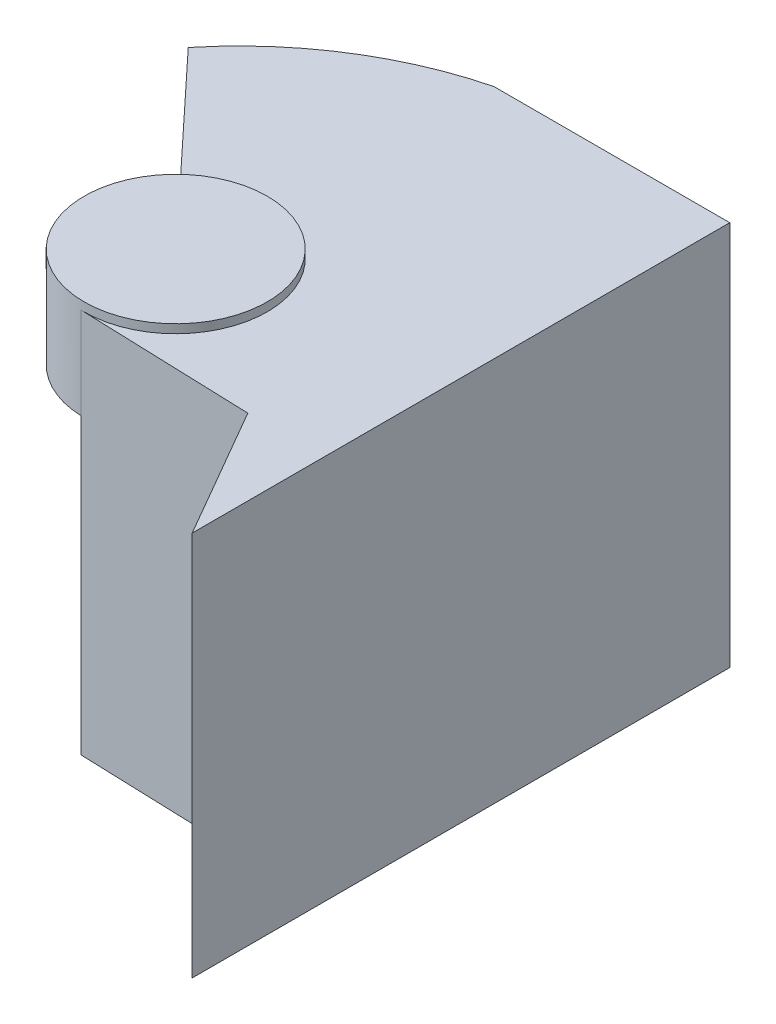
ISO-10303-21;
HEADER;
FILE_DESCRIPTION(('STEP AP214'),'2;1');
FILE_NAME('part.step','',(''),(''),'','','');
FILE_SCHEMA(('AUTOMOTIVE_DESIGN { 1 0 10303 214 1 1 1 1 }'));
ENDSEC;
DATA;
#1=APPLICATION_CONTEXT('core data for automotive mechanical design processes');
#2=APPLICATION_PROTOCOL_DEFINITION('international standard','automotive_design',2000,#1);
#3=PRODUCT_CONTEXT('',#1,'mechanical');
#4=PRODUCT('Part','Part','',(#3));
#5=PRODUCT_RELATED_PRODUCT_CATEGORY('part','',(#4));
#6=PRODUCT_DEFINITION_FORMATION('','',#4);
#7=PRODUCT_DEFINITION_CONTEXT('part definition',#1,'design');
#8=PRODUCT_DEFINITION('design','',#6,#7);
#9=PRODUCT_DEFINITION_SHAPE('','',#8);
#10=(LENGTH_UNIT() NAMED_UNIT(*) SI_UNIT(.MILLI.,.METRE.));
#11=(NAMED_UNIT(*) PLANE_ANGLE_UNIT() SI_UNIT($,.RADIAN.));
#12=(NAMED_UNIT(*) SI_UNIT($,.STERADIAN.) SOLID_ANGLE_UNIT());
#13=UNCERTAINTY_MEASURE_WITH_UNIT(LENGTH_MEASURE(1.E-05),#10,'distance_accuracy_value','');
#14=(GEOMETRIC_REPRESENTATION_CONTEXT(3) GLOBAL_UNCERTAINTY_ASSIGNED_CONTEXT((#13)) GLOBAL_UNIT_ASSIGNED_CONTEXT((#10,
#11,#12)) REPRESENTATION_CONTEXT('',''));
#15=CARTESIAN_POINT('',(0.,0.,0.));
#16=DIRECTION('',(0.,0.,1.));
#17=DIRECTION('',(1.,0.,0.));
#18=AXIS2_PLACEMENT_3D('',#15,#16,#17);
#19=CARTESIAN_POINT('',(-143.94149440041,-223.,231.490942435364));
#20=DIRECTION('',(-0.999414944004102,0.,-0.0342018961649362));
#21=DIRECTION('',(-0.0342018961649362,0.,0.999414944004102));
#22=AXIS2_PLACEMENT_3D('',#19,#20,#21);
#23=PLANE('',#22);
#24=DIRECTION('',(0.,1.,0.));
#25=VECTOR('',#24,1.);
#26=CARTESIAN_POINT('',(-143.94149440041,-223.,231.490942435364));
#27=LINE('',#26,#25);
#28=CARTESIAN_POINT('',(-143.94149440041,-223.,231.490942435364));
#29=VERTEX_POINT('',#28);
#30=CARTESIAN_POINT('',(-143.94149440041,-53.,231.490942435364));
#31=VERTEX_POINT('',#30);
#32=EDGE_CURVE('E114',#29,#31,#27,.T.);
#33=ORIENTED_EDGE('',*,*,#32,.T.);
#34=DIRECTION('',(0.0342018961649362,0.,-0.999414944004102));
#35=VECTOR('',#34,1.);
#36=CARTESIAN_POINT('',(-143.94149440041,-53.,231.490942435364));
#37=LINE('',#36,#35);
#38=CARTESIAN_POINT('',(-142.128793903668,-53.,178.521950403146));
#39=VERTEX_POINT('',#38);
#40=EDGE_CURVE('E138',#31,#39,#37,.T.);
#41=ORIENTED_EDGE('',*,*,#40,.T.);
#42=DIRECTION('',(0.,1.,0.));
#43=VECTOR('',#42,1.);
#44=CARTESIAN_POINT('',(-142.128793903668,-223.,178.521950403146));
#45=LINE('',#44,#43);
#46=CARTESIAN_POINT('',(-142.128793903668,-223.,178.521950403146));
#47=VERTEX_POINT('',#46);
#48=EDGE_CURVE('E154',#47,#39,#45,.T.);
#49=ORIENTED_EDGE('',*,*,#48,.F.);
#50=DIRECTION('',(-0.0342018961649362,0.,0.999414944004102));
#51=VECTOR('',#50,1.);
#52=CARTESIAN_POINT('',(-143.94149440041,-223.,231.490942435364));
#53=LINE('',#52,#51);
#54=EDGE_CURVE('E127',#47,#29,#53,.T.);
#55=ORIENTED_EDGE('',*,*,#54,.T.);
#56=EDGE_LOOP('',(#33,#41,#49,#55));
#57=FACE_BOUND('',#56,.T.);
#58=ADVANCED_FACE('F38',(#57),#23,.T.);
#59=CARTESIAN_POINT('',(0.,-223.,0.));
#60=DIRECTION('',(0.,0.,-1.));
#61=DIRECTION('',(-1.,0.,0.));
#62=AXIS2_PLACEMENT_3D('',#59,#60,#61);
#63=PLANE('',#62);
#64=DIRECTION('',(-1.,0.,0.));
#65=VECTOR('',#64,1.);
#66=CARTESIAN_POINT('',(0.,0.,0.));
#67=LINE('',#66,#65);
#68=CARTESIAN_POINT('',(0.,0.,0.));
#69=VERTEX_POINT('',#68);
#70=CARTESIAN_POINT('',(-136.456740168811,0.,0.));
#71=VERTEX_POINT('',#70);
#72=EDGE_CURVE('E134',#69,#71,#67,.T.);
#73=ORIENTED_EDGE('',*,*,#72,.F.);
#74=DIRECTION('',(0.,1.,0.));
#75=VECTOR('',#74,1.);
#76=CARTESIAN_POINT('',(0.,-223.,0.));
#77=LINE('',#76,#75);
#78=CARTESIAN_POINT('',(0.,-223.,0.));
#79=VERTEX_POINT('',#78);
#80=EDGE_CURVE('E55',#79,#69,#77,.T.);
#81=ORIENTED_EDGE('',*,*,#80,.F.);
#82=DIRECTION('',(-1.,0.,0.));
#83=VECTOR('',#82,1.);
#84=CARTESIAN_POINT('',(0.,-223.,0.));
#85=LINE('',#84,#83);
#86=CARTESIAN_POINT('',(-136.456740168811,-223.,0.));
#87=VERTEX_POINT('',#86);
#88=EDGE_CURVE('E150',#79,#87,#85,.T.);
#89=ORIENTED_EDGE('',*,*,#88,.T.);
#90=DIRECTION('',(0.,1.,0.));
#91=VECTOR('',#90,1.);
#92=CARTESIAN_POINT('',(-136.456740168811,-223.,0.));
#93=LINE('',#92,#91);
#94=EDGE_CURVE('E91',#87,#71,#93,.T.);
#95=ORIENTED_EDGE('',*,*,#94,.T.);
#96=EDGE_LOOP('',(#73,#81,#89,#95));
#97=FACE_BOUND('',#96,.T.);
#98=ADVANCED_FACE('F40',(#97),#63,.T.);
#99=CARTESIAN_POINT('',(0.,-223.,0.));
#100=DIRECTION('',(1.,0.,0.));
#101=DIRECTION('',(0.,0.,-1.));
#102=AXIS2_PLACEMENT_3D('',#99,#100,#101);
#103=PLANE('',#102);
#104=DIRECTION('',(0.,0.,-1.));
#105=VECTOR('',#104,1.);
#106=CARTESIAN_POINT('',(0.,0.,0.));
#107=LINE('',#106,#105);
#108=CARTESIAN_POINT('',(0.,0.,311.121367584888));
#109=VERTEX_POINT('',#108);
#110=EDGE_CURVE('E147',#109,#69,#107,.T.);
#111=ORIENTED_EDGE('',*,*,#110,.F.);
#112=DIRECTION('',(0.,1.,0.));
#113=VECTOR('',#112,1.);
#114=CARTESIAN_POINT('',(0.,-223.,311.121367584888));
#115=LINE('',#114,#113);
#116=CARTESIAN_POINT('',(0.,-223.,311.121367584888));
#117=VERTEX_POINT('',#116);
#118=EDGE_CURVE('E79',#117,#109,#115,.T.);
#119=ORIENTED_EDGE('',*,*,#118,.F.);
#120=DIRECTION('',(0.,0.,-1.));
#121=VECTOR('',#120,1.);
#122=CARTESIAN_POINT('',(0.,-223.,0.));
#123=LINE('',#122,#121);
#124=EDGE_CURVE('E122',#117,#79,#123,.T.);
#125=ORIENTED_EDGE('',*,*,#124,.T.);
#126=ORIENTED_EDGE('',*,*,#80,.T.);
#127=EDGE_LOOP('',(#111,#119,#125,#126));
#128=FACE_BOUND('',#127,.T.);
#129=ADVANCED_FACE('F213',(#128),#103,.T.);
#130=CARTESIAN_POINT('',(0.,-223.,311.121367584888));
#131=DIRECTION('',(-0.866025403784442,0.,0.499999999999995));
#132=DIRECTION('',(0.499999999999995,0.,0.866025403784441));
#133=AXIS2_PLACEMENT_3D('',#130,#131,#132);
#134=PLANE('',#133);
#135=DIRECTION('',(0.499999999999995,0.,0.866025403784441));
#136=VECTOR('',#135,1.);
#137=CARTESIAN_POINT('',(0.,0.,311.121367584888));
#138=LINE('',#137,#136);
#139=CARTESIAN_POINT('',(-43.9999999999996,0.,234.911132051857));
#140=VERTEX_POINT('',#139);
#141=EDGE_CURVE('E109',#140,#109,#138,.T.);
#142=ORIENTED_EDGE('',*,*,#141,.F.);
#143=DIRECTION('',(0.,1.,0.));
#144=VECTOR('',#143,1.);
#145=CARTESIAN_POINT('',(-43.9999999999996,-223.,234.911132051857));
#146=LINE('',#145,#144);
#147=CARTESIAN_POINT('',(-43.9999999999996,-223.,234.911132051857));
#148=VERTEX_POINT('',#147);
#149=EDGE_CURVE('E104',#148,#140,#146,.T.);
#150=ORIENTED_EDGE('',*,*,#149,.F.);
#151=DIRECTION('',(0.499999999999995,0.,0.866025403784441));
#152=VECTOR('',#151,1.);
#153=CARTESIAN_POINT('',(0.,-223.,311.121367584888));
#154=LINE('',#153,#152);
#155=EDGE_CURVE('E107',#148,#117,#154,.T.);
#156=ORIENTED_EDGE('',*,*,#155,.T.);
#157=ORIENTED_EDGE('',*,*,#118,.T.);
#158=EDGE_LOOP('',(#142,#150,#156,#157));
#159=FACE_BOUND('',#158,.T.);
#160=ADVANCED_FACE('F106',(#159),#134,.T.);
#161=CARTESIAN_POINT('',(-43.9999999999996,-223.,234.911132051857));
#162=DIRECTION('',(-0.0342018961649354,0.,0.999414944004102));
#163=DIRECTION('',(0.999414944004102,0.,0.0342018961649354));
#164=AXIS2_PLACEMENT_3D('',#161,#162,#163);
#165=PLANE('',#164);
#166=DIRECTION('',(0.999414944004102,0.,0.0342018961649354));
#167=VECTOR('',#166,1.);
#168=CARTESIAN_POINT('',(-43.9999999999996,0.,234.911132051857));
#169=LINE('',#168,#167);
#170=CARTESIAN_POINT('',(-143.94149440041,0.,231.490942435364));
#171=VERTEX_POINT('',#170);
#172=EDGE_CURVE('E144',#171,#140,#169,.T.);
#173=ORIENTED_EDGE('',*,*,#172,.F.);
#174=DIRECTION('',(0.,1.,0.));
#175=VECTOR('',#174,1.);
#176=CARTESIAN_POINT('',(-143.94149440041,-53.,231.490942435364));
#177=LINE('',#176,#175);
#178=EDGE_CURVE('E169',#31,#171,#177,.T.);
#179=ORIENTED_EDGE('',*,*,#178,.F.);
#180=ORIENTED_EDGE('',*,*,#32,.F.);
#181=DIRECTION('',(0.999414944004102,0.,0.0342018961649354));
#182=VECTOR('',#181,1.);
#183=CARTESIAN_POINT('',(-43.9999999999996,-223.,234.911132051857));
#184=LINE('',#183,#182);
#185=EDGE_CURVE('E120',#29,#148,#184,.T.);
#186=ORIENTED_EDGE('',*,*,#185,.T.);
#187=ORIENTED_EDGE('',*,*,#149,.T.);
#188=EDGE_LOOP('',(#173,#179,#180,#186,#187));
#189=FACE_BOUND('',#188,.T.);
#190=ADVANCED_FACE('F124',(#189),#165,.T.);
#191=CARTESIAN_POINT('',(-142.128793903668,-223.,178.521950403146));
#192=DIRECTION('',(-0.730877476832137,0.,0.682508691416812));
#193=DIRECTION('',(0.682508691416812,0.,0.730877476832137));
#194=AXIS2_PLACEMENT_3D('',#191,#192,#193);
#195=PLANE('',#194);
#196=DIRECTION('',(0.,1.,0.));
#197=VECTOR('',#196,1.);
#198=CARTESIAN_POINT('',(-178.301754548759,-53.,139.785444131043));
#199=LINE('',#198,#197);
#200=CARTESIAN_POINT('',(-178.301754548759,0.,139.785444131043));
#201=VERTEX_POINT('',#200);
#202=CARTESIAN_POINT('',(-178.301754548759,-53.,139.785444131043));
#203=VERTEX_POINT('',#202);
#204=EDGE_CURVE('E174',#201,#203,#199,.F.);
#205=ORIENTED_EDGE('',*,*,#204,.F.);
#206=DIRECTION('',(0.682508691416812,0.,0.730877476832137));
#207=VECTOR('',#206,1.);
#208=CARTESIAN_POINT('',(-142.128793903668,0.,178.521950403146));
#209=LINE('',#208,#207);
#210=CARTESIAN_POINT('',(-244.50509761619,0.,68.8903288783257));
#211=VERTEX_POINT('',#210);
#212=EDGE_CURVE('E141',#211,#201,#209,.T.);
#213=ORIENTED_EDGE('',*,*,#212,.F.);
#214=DIRECTION('',(0.,1.,0.));
#215=VECTOR('',#214,1.);
#216=CARTESIAN_POINT('',(-244.50509761619,-223.,68.8903288783257));
#217=LINE('',#216,#215);
#218=CARTESIAN_POINT('',(-244.50509761619,-223.,68.8903288783257));
#219=VERTEX_POINT('',#218);
#220=EDGE_CURVE('E157',#219,#211,#217,.T.);
#221=ORIENTED_EDGE('',*,*,#220,.F.);
#222=DIRECTION('',(0.682508691416812,0.,0.730877476832137));
#223=VECTOR('',#222,1.);
#224=CARTESIAN_POINT('',(-142.128793903668,-223.,178.521950403146));
#225=LINE('',#224,#223);
#226=EDGE_CURVE('E129',#219,#47,#225,.T.);
#227=ORIENTED_EDGE('',*,*,#226,.T.);
#228=ORIENTED_EDGE('',*,*,#48,.T.);
#229=DIRECTION('',(-0.682508691416812,0.,-0.730877476832137));
#230=VECTOR('',#229,1.);
#231=CARTESIAN_POINT('',(-142.128793903668,-53.,178.521950403146));
#232=LINE('',#231,#230);
#233=EDGE_CURVE('E11',#39,#203,#232,.T.);
#234=ORIENTED_EDGE('',*,*,#233,.T.);
#235=EDGE_LOOP('',(#205,#213,#221,#227,#228,#234));
#236=FACE_BOUND('',#235,.T.);
#237=ADVANCED_FACE('F181',(#236),#195,.T.);
#238=CARTESIAN_POINT('',(-86.9244401830012,-223.,196.864296555053));
#239=DIRECTION('',(0.,1.,0.));
#240=DIRECTION('',(0.,0.,1.));
#241=AXIS2_PLACEMENT_3D('',#238,#239,#240);
#242=CYLINDRICAL_SURFACE('',#241,203.);
#243=CARTESIAN_POINT('',(-86.9244401830012,0.,196.864296555053));
#244=DIRECTION('',(0.,1.,0.));
#245=DIRECTION('',(0.,0.,-1.));
#246=AXIS2_PLACEMENT_3D('',#243,#244,#245);
#247=CIRCLE('',#246,203.);
#248=EDGE_CURVE('E137',#71,#211,#247,.T.);
#249=ORIENTED_EDGE('',*,*,#248,.F.);
#250=ORIENTED_EDGE('',*,*,#94,.F.);
#251=CARTESIAN_POINT('',(-86.9244401830012,-223.,196.864296555053));
#252=DIRECTION('',(0.,1.,0.));
#253=DIRECTION('',(0.,0.,-1.));
#254=AXIS2_PLACEMENT_3D('',#251,#252,#253);
#255=CIRCLE('',#254,203.);
#256=EDGE_CURVE('E182',#87,#219,#255,.T.);
#257=ORIENTED_EDGE('',*,*,#256,.T.);
#258=ORIENTED_EDGE('',*,*,#220,.T.);
#259=EDGE_LOOP('',(#249,#250,#257,#258));
#260=FACE_BOUND('',#259,.T.);
#261=ADVANCED_FACE('F218',(#260),#242,.T.);
#262=CARTESIAN_POINT('',(-86.9244401830012,-223.,196.864296555053));
#263=DIRECTION('',(0.,-1.,0.));
#264=DIRECTION('',(0.,0.,-1.));
#265=AXIS2_PLACEMENT_3D('',#262,#263,#264);
#266=PLANE('',#265);
#267=ORIENTED_EDGE('',*,*,#88,.F.);
#268=ORIENTED_EDGE('',*,*,#124,.F.);
#269=ORIENTED_EDGE('',*,*,#155,.F.);
#270=ORIENTED_EDGE('',*,*,#185,.F.);
#271=ORIENTED_EDGE('',*,*,#54,.F.);
#272=ORIENTED_EDGE('',*,*,#226,.F.);
#273=ORIENTED_EDGE('',*,*,#256,.F.);
#274=EDGE_LOOP('',(#267,#268,#269,#270,#271,#272,#273));
#275=FACE_BOUND('',#274,.T.);
#276=ADVANCED_FACE('F118',(#275),#266,.T.);
#277=CARTESIAN_POINT('',(-86.9244401830012,0.,196.864296555053));
#278=DIRECTION('',(0.,-1.,0.));
#279=DIRECTION('',(0.,0.,-1.));
#280=AXIS2_PLACEMENT_3D('',#277,#278,#279);
#281=PLANE('',#280);
#282=ORIENTED_EDGE('',*,*,#212,.T.);
#283=CARTESIAN_POINT('',(-142.128793903668,0.,178.521950403146));
#284=DIRECTION('',(0.,-1.,0.));
#285=DIRECTION('',(0.,0.,-1.));
#286=AXIS2_PLACEMENT_3D('',#283,#284,#285);
#287=CIRCLE('',#286,53.);
#288=EDGE_CURVE('E47',#201,#171,#287,.T.);
#289=ORIENTED_EDGE('',*,*,#288,.T.);
#290=ORIENTED_EDGE('',*,*,#172,.T.);
#291=ORIENTED_EDGE('',*,*,#141,.T.);
#292=ORIENTED_EDGE('',*,*,#110,.T.);
#293=ORIENTED_EDGE('',*,*,#72,.T.);
#294=ORIENTED_EDGE('',*,*,#248,.T.);
#295=EDGE_LOOP('',(#282,#289,#290,#291,#292,#293,#294));
#296=FACE_BOUND('',#295,.T.);
#297=ADVANCED_FACE('F162',(#296),#281,.F.);
#298=CARTESIAN_POINT('',(-142.128793903668,-53.,178.521950403146));
#299=DIRECTION('',(0.,1.,0.));
#300=DIRECTION('',(0.,0.,1.));
#301=AXIS2_PLACEMENT_3D('',#298,#299,#300);
#302=CYLINDRICAL_SURFACE('',#301,53.);
#303=CARTESIAN_POINT('',(-142.128793903668,-53.,178.521950403146));
#304=DIRECTION('',(0.,1.,0.));
#305=DIRECTION('',(0.,0.,1.));
#306=AXIS2_PLACEMENT_3D('',#303,#304,#305);
#307=CIRCLE('',#306,53.);
#308=EDGE_CURVE('E188',#203,#31,#307,.T.);
#309=ORIENTED_EDGE('',*,*,#308,.T.);
#310=ORIENTED_EDGE('',*,*,#178,.T.);
#311=ORIENTED_EDGE('',*,*,#288,.F.);
#312=ORIENTED_EDGE('',*,*,#204,.T.);
#313=EDGE_LOOP('',(#309,#310,#311,#312));
#314=FACE_BOUND('',#313,.T.);
#315=CARTESIAN_POINT('',(-142.128793903668,5.,178.521950403146));
#316=DIRECTION('',(0.,1.,0.));
#317=DIRECTION('',(0.,0.,1.));
#318=AXIS2_PLACEMENT_3D('',#315,#316,#317);
#319=CIRCLE('',#318,53.);
#320=CARTESIAN_POINT('',(-142.128793903668,5.,231.521950403146));
#321=VERTEX_POINT('',#320);
#322=EDGE_CURVE('E190',#321,#321,#319,.T.);
#323=ORIENTED_EDGE('',*,*,#322,.F.);
#324=EDGE_LOOP('',(#323));
#325=FACE_BOUND('',#324,.T.);
#326=ADVANCED_FACE('F196',(#314,#325),#302,.T.);
#327=CARTESIAN_POINT('',(-142.128793903668,-53.,178.521950403146));
#328=DIRECTION('',(0.,1.,0.));
#329=DIRECTION('',(0.,0.,1.));
#330=AXIS2_PLACEMENT_3D('',#327,#328,#329);
#331=PLANE('',#330);
#332=ORIENTED_EDGE('',*,*,#40,.F.);
#333=ORIENTED_EDGE('',*,*,#308,.F.);
#334=ORIENTED_EDGE('',*,*,#233,.F.);
#335=EDGE_LOOP('',(#332,#333,#334));
#336=FACE_BOUND('',#335,.T.);
#337=ADVANCED_FACE('F198',(#336),#331,.F.);
#338=CARTESIAN_POINT('',(-142.128793903668,5.,178.521950403146));
#339=DIRECTION('',(0.,1.,0.));
#340=DIRECTION('',(0.,0.,1.));
#341=AXIS2_PLACEMENT_3D('',#338,#339,#340);
#342=PLANE('',#341);
#343=ORIENTED_EDGE('',*,*,#322,.T.);
#344=EDGE_LOOP('',(#343));
#345=FACE_BOUND('',#344,.T.);
#346=ADVANCED_FACE('F194',(#345),#342,.T.);
#347=CLOSED_SHELL('',(#58,#98,#129,#160,#190,#237,#261,#276,#297,#326,#337,#346));
#348=MANIFOLD_SOLID_BREP('B2',#347);
#349=ADVANCED_BREP_SHAPE_REPRESENTATION('',(#18,#348),#14);
#350=SHAPE_DEFINITION_REPRESENTATION(#9,#349);
ENDSEC;
END-ISO-10303-21;
